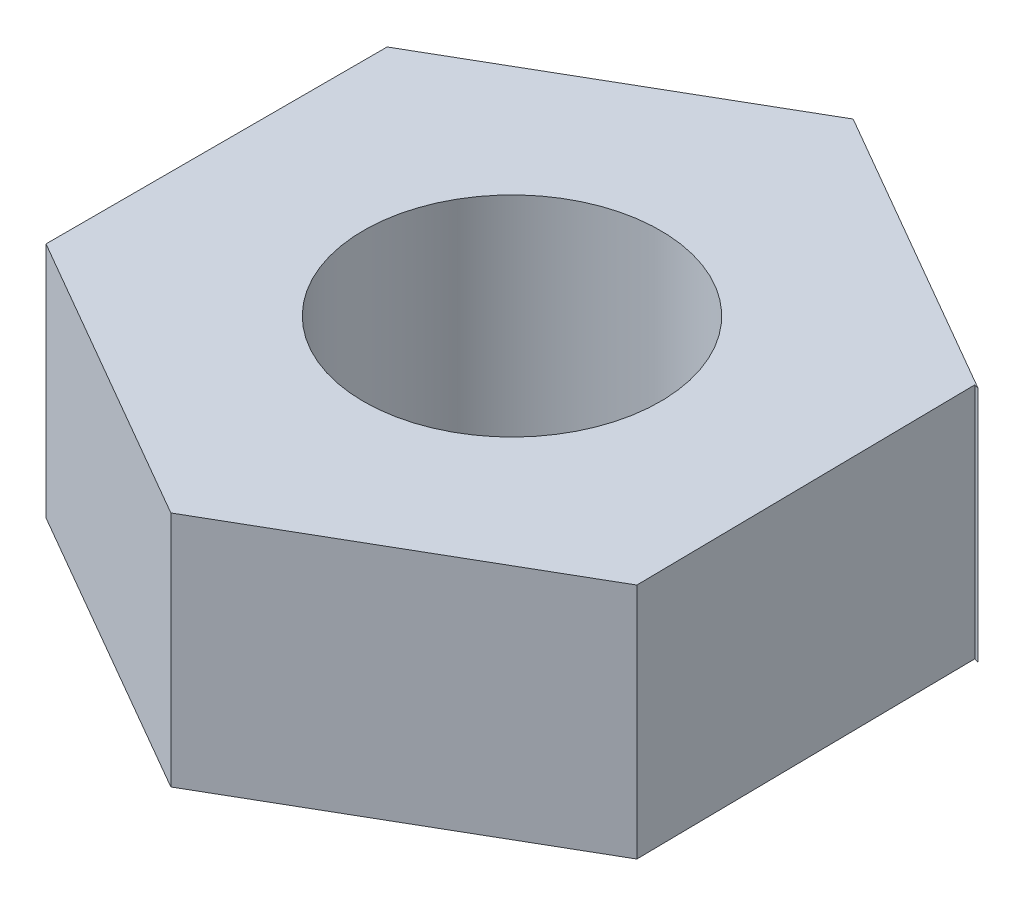
ISO-10303-21;
HEADER;
FILE_DESCRIPTION(('STEP AP214'),'2;1');
FILE_NAME('part.step','',(''),(''),'','','');
FILE_SCHEMA(('AUTOMOTIVE_DESIGN { 1 0 10303 214 1 1 1 1 }'));
ENDSEC;
DATA;
#1=APPLICATION_CONTEXT('core data for automotive mechanical design processes');
#2=APPLICATION_PROTOCOL_DEFINITION('international standard','automotive_design',2000,#1);
#3=PRODUCT_CONTEXT('',#1,'mechanical');
#4=PRODUCT('Part','Part','',(#3));
#5=PRODUCT_RELATED_PRODUCT_CATEGORY('part','',(#4));
#6=PRODUCT_DEFINITION_FORMATION('','',#4);
#7=PRODUCT_DEFINITION_CONTEXT('part definition',#1,'design');
#8=PRODUCT_DEFINITION('design','',#6,#7);
#9=PRODUCT_DEFINITION_SHAPE('','',#8);
#10=(LENGTH_UNIT() NAMED_UNIT(*) SI_UNIT(.MILLI.,.METRE.));
#11=(NAMED_UNIT(*) PLANE_ANGLE_UNIT() SI_UNIT($,.RADIAN.));
#12=(NAMED_UNIT(*) SI_UNIT($,.STERADIAN.) SOLID_ANGLE_UNIT());
#13=UNCERTAINTY_MEASURE_WITH_UNIT(LENGTH_MEASURE(1.E-05),#10,'distance_accuracy_value','');
#14=(GEOMETRIC_REPRESENTATION_CONTEXT(3) GLOBAL_UNCERTAINTY_ASSIGNED_CONTEXT((#13)) GLOBAL_UNIT_ASSIGNED_CONTEXT((#10,
#11,#12)) REPRESENTATION_CONTEXT('',''));
#15=CARTESIAN_POINT('',(0.,0.,0.));
#16=DIRECTION('',(0.,0.,1.));
#17=DIRECTION('',(1.,0.,0.));
#18=AXIS2_PLACEMENT_3D('',#15,#16,#17);
#19=CARTESIAN_POINT('',(-1.99185842870421,1.6,0.));
#20=DIRECTION('',(-1.,0.,0.));
#21=DIRECTION('',(0.,0.,1.));
#22=AXIS2_PLACEMENT_3D('',#19,#20,#21);
#23=PLANE('',#22);
#24=DIRECTION('',(0.,0.,-1.));
#25=VECTOR('',#24,1.);
#26=CARTESIAN_POINT('',(-1.99185842870421,0.,0.));
#27=LINE('',#26,#25);
#28=CARTESIAN_POINT('',(-1.99185842870422,0.,1.14999999999998));
#29=VERTEX_POINT('',#28);
#30=CARTESIAN_POINT('',(-1.9918584287042,0.,-1.15000000000002));
#31=VERTEX_POINT('',#30);
#32=EDGE_CURVE('E124',#29,#31,#27,.T.);
#33=ORIENTED_EDGE('',*,*,#32,.F.);
#34=DIRECTION('',(0.,-1.,0.));
#35=VECTOR('',#34,1.);
#36=CARTESIAN_POINT('',(-1.99185842870422,1.6,1.14999999999998));
#37=LINE('',#36,#35);
#38=CARTESIAN_POINT('',(-1.99185842870422,1.6,1.14999999999998));
#39=VERTEX_POINT('',#38);
#40=EDGE_CURVE('E11',#39,#29,#37,.T.);
#41=ORIENTED_EDGE('',*,*,#40,.F.);
#42=DIRECTION('',(0.,0.,-1.));
#43=VECTOR('',#42,1.);
#44=CARTESIAN_POINT('',(-1.99185842870421,1.6,0.));
#45=LINE('',#44,#43);
#46=CARTESIAN_POINT('',(-1.9918584287042,1.6,-1.15000000000002));
#47=VERTEX_POINT('',#46);
#48=EDGE_CURVE('E163',#39,#47,#45,.T.);
#49=ORIENTED_EDGE('',*,*,#48,.T.);
#50=DIRECTION('',(0.,-1.,0.));
#51=VECTOR('',#50,1.);
#52=CARTESIAN_POINT('',(-1.9918584287042,1.6,-1.15000000000002));
#53=LINE('',#52,#51);
#54=EDGE_CURVE('E50',#47,#31,#53,.T.);
#55=ORIENTED_EDGE('',*,*,#54,.T.);
#56=EDGE_LOOP('',(#33,#41,#49,#55));
#57=FACE_BOUND('',#56,.T.);
#58=ADVANCED_FACE('F33',(#57),#23,.T.);
#59=CARTESIAN_POINT('',(-0.995929214352118,1.6,1.72499999999999));
#60=DIRECTION('',(-0.500000000000007,0.,0.866025403784434));
#61=DIRECTION('',(0.866025403784435,0.,0.500000000000007));
#62=AXIS2_PLACEMENT_3D('',#59,#60,#61);
#63=PLANE('',#62);
#64=DIRECTION('',(-0.866025403784434,0.,-0.500000000000007));
#65=VECTOR('',#64,1.);
#66=CARTESIAN_POINT('',(-0.995929214352118,0.,1.72499999999999));
#67=LINE('',#66,#65);
#68=CARTESIAN_POINT('',(0.,0.,2.3));
#69=VERTEX_POINT('',#68);
#70=EDGE_CURVE('E126',#69,#29,#67,.T.);
#71=ORIENTED_EDGE('',*,*,#70,.F.);
#72=DIRECTION('',(0.,-1.,0.));
#73=VECTOR('',#72,1.);
#74=CARTESIAN_POINT('',(0.,1.6,2.3));
#75=LINE('',#74,#73);
#76=CARTESIAN_POINT('',(0.,1.6,2.3));
#77=VERTEX_POINT('',#76);
#78=EDGE_CURVE('E42',#77,#69,#75,.T.);
#79=ORIENTED_EDGE('',*,*,#78,.F.);
#80=DIRECTION('',(-0.866025403784434,0.,-0.500000000000007));
#81=VECTOR('',#80,1.);
#82=CARTESIAN_POINT('',(-0.995929214352118,1.6,1.72499999999999));
#83=LINE('',#82,#81);
#84=EDGE_CURVE('E161',#77,#39,#83,.T.);
#85=ORIENTED_EDGE('',*,*,#84,.T.);
#86=ORIENTED_EDGE('',*,*,#40,.T.);
#87=EDGE_LOOP('',(#71,#79,#85,#86));
#88=FACE_BOUND('',#87,.T.);
#89=ADVANCED_FACE('F155',(#88),#63,.T.);
#90=CARTESIAN_POINT('',(0.995929214352093,1.6,1.72500000000001));
#91=DIRECTION('',(0.499999999999994,0.,0.866025403784442));
#92=DIRECTION('',(0.866025403784442,0.,-0.499999999999994));
#93=AXIS2_PLACEMENT_3D('',#90,#91,#92);
#94=PLANE('',#93);
#95=DIRECTION('',(-0.866025403784442,0.,0.499999999999995));
#96=VECTOR('',#95,1.);
#97=CARTESIAN_POINT('',(0.995929214352093,0.,1.72500000000001));
#98=LINE('',#97,#96);
#99=CARTESIAN_POINT('',(1.99185842870421,0.,1.15000000000001));
#100=VERTEX_POINT('',#99);
#101=EDGE_CURVE('E129',#100,#69,#98,.T.);
#102=ORIENTED_EDGE('',*,*,#101,.F.);
#103=DIRECTION('',(0.,-1.,0.));
#104=VECTOR('',#103,1.);
#105=CARTESIAN_POINT('',(1.99185842870421,1.6,1.15000000000001));
#106=LINE('',#105,#104);
#107=CARTESIAN_POINT('',(1.99185842870421,1.6,1.15000000000001));
#108=VERTEX_POINT('',#107);
#109=EDGE_CURVE('E145',#108,#100,#106,.T.);
#110=ORIENTED_EDGE('',*,*,#109,.F.);
#111=DIRECTION('',(-0.866025403784442,0.,0.499999999999995));
#112=VECTOR('',#111,1.);
#113=CARTESIAN_POINT('',(0.995929214352093,1.6,1.72500000000001));
#114=LINE('',#113,#112);
#115=EDGE_CURVE('E151',#108,#77,#114,.T.);
#116=ORIENTED_EDGE('',*,*,#115,.T.);
#117=ORIENTED_EDGE('',*,*,#78,.T.);
#118=EDGE_LOOP('',(#102,#110,#116,#117));
#119=FACE_BOUND('',#118,.T.);
#120=ADVANCED_FACE('F150',(#119),#94,.T.);
#121=CARTESIAN_POINT('',(1.9767126415659,1.6,-0.0254697068984855));
#122=DIRECTION('',(0.999917000257078,0.,-0.0128838114270296));
#123=DIRECTION('',(-0.0128838114270296,0.,-0.999917000257078));
#124=AXIS2_PLACEMENT_3D('',#121,#122,#123);
#125=PLANE('',#124);
#126=DIRECTION('',(0.0128838114270296,0.,0.999917000257078));
#127=VECTOR('',#126,1.);
#128=CARTESIAN_POINT('',(1.9767126415659,0.,-0.0254697068984855));
#129=LINE('',#128,#127);
#130=CARTESIAN_POINT('',(1.9621216011351,0.,-1.15788533257131));
#131=VERTEX_POINT('',#130);
#132=EDGE_CURVE('E132',#131,#100,#129,.T.);
#133=ORIENTED_EDGE('',*,*,#132,.F.);
#134=DIRECTION('',(0.,-1.,0.));
#135=VECTOR('',#134,1.);
#136=CARTESIAN_POINT('',(1.9621216011351,1.6,-1.15788533257131));
#137=LINE('',#136,#135);
#138=CARTESIAN_POINT('',(1.9621216011351,1.6,-1.15788533257131));
#139=VERTEX_POINT('',#138);
#140=EDGE_CURVE('E103',#139,#131,#137,.T.);
#141=ORIENTED_EDGE('',*,*,#140,.F.);
#142=DIRECTION('',(0.0128838114270296,0.,0.999917000257078));
#143=VECTOR('',#142,1.);
#144=CARTESIAN_POINT('',(1.9767126415659,1.6,-0.0254697068984855));
#145=LINE('',#144,#143);
#146=EDGE_CURVE('E113',#139,#108,#145,.T.);
#147=ORIENTED_EDGE('',*,*,#146,.T.);
#148=ORIENTED_EDGE('',*,*,#109,.T.);
#149=EDGE_LOOP('',(#133,#141,#147,#148));
#150=FACE_BOUND('',#149,.T.);
#151=ADVANCED_FACE('F160',(#150),#125,.T.);
#152=CARTESIAN_POINT('',(0.415769592089128,1.6,-1.56793243108264));
#153=DIRECTION('',(-0.25631232080257,0.,0.966594017261022));
#154=DIRECTION('',(0.966594017261022,0.,0.25631232080257));
#155=AXIS2_PLACEMENT_3D('',#152,#153,#154);
#156=PLANE('',#155);
#157=DIRECTION('',(-0.966594017261022,0.,-0.25631232080257));
#158=VECTOR('',#157,1.);
#159=CARTESIAN_POINT('',(0.415769592089128,0.,-1.56793243108264));
#160=LINE('',#159,#158);
#161=CARTESIAN_POINT('',(1.99185842870421,0.,-1.15));
#162=VERTEX_POINT('',#161);
#163=EDGE_CURVE('E99',#162,#131,#160,.T.);
#164=ORIENTED_EDGE('',*,*,#163,.F.);
#165=DIRECTION('',(0.,-1.,0.));
#166=VECTOR('',#165,1.);
#167=CARTESIAN_POINT('',(1.99185842870421,1.6,-1.15));
#168=LINE('',#167,#166);
#169=CARTESIAN_POINT('',(1.99185842870421,1.6,-1.15));
#170=VERTEX_POINT('',#169);
#171=EDGE_CURVE('E94',#170,#162,#168,.T.);
#172=ORIENTED_EDGE('',*,*,#171,.F.);
#173=DIRECTION('',(-0.966594017261022,0.,-0.25631232080257));
#174=VECTOR('',#173,1.);
#175=CARTESIAN_POINT('',(0.415769592089128,1.6,-1.56793243108264));
#176=LINE('',#175,#174);
#177=EDGE_CURVE('E97',#170,#139,#176,.T.);
#178=ORIENTED_EDGE('',*,*,#177,.T.);
#179=ORIENTED_EDGE('',*,*,#140,.T.);
#180=EDGE_LOOP('',(#164,#172,#178,#179));
#181=FACE_BOUND('',#180,.T.);
#182=ADVANCED_FACE('F96',(#181),#156,.T.);
#183=CARTESIAN_POINT('',(0.995929214352106,1.6,-1.725));
#184=DIRECTION('',(0.500000000000001,0.,-0.866025403784438));
#185=DIRECTION('',(-0.866025403784438,0.,-0.500000000000001));
#186=AXIS2_PLACEMENT_3D('',#183,#184,#185);
#187=PLANE('',#186);
#188=DIRECTION('',(0.866025403784438,0.,0.500000000000001));
#189=VECTOR('',#188,1.);
#190=CARTESIAN_POINT('',(0.995929214352106,0.,-1.725));
#191=LINE('',#190,#189);
#192=CARTESIAN_POINT('',(0.,0.,-2.3));
#193=VERTEX_POINT('',#192);
#194=EDGE_CURVE('E136',#193,#162,#191,.T.);
#195=ORIENTED_EDGE('',*,*,#194,.F.);
#196=DIRECTION('',(0.,-1.,0.));
#197=VECTOR('',#196,1.);
#198=CARTESIAN_POINT('',(0.,1.6,-2.3));
#199=LINE('',#198,#197);
#200=CARTESIAN_POINT('',(0.,1.6,-2.3));
#201=VERTEX_POINT('',#200);
#202=EDGE_CURVE('E72',#201,#193,#199,.T.);
#203=ORIENTED_EDGE('',*,*,#202,.F.);
#204=DIRECTION('',(0.866025403784438,0.,0.500000000000001));
#205=VECTOR('',#204,1.);
#206=CARTESIAN_POINT('',(0.995929214352106,1.6,-1.725));
#207=LINE('',#206,#205);
#208=EDGE_CURVE('E110',#201,#170,#207,.T.);
#209=ORIENTED_EDGE('',*,*,#208,.T.);
#210=ORIENTED_EDGE('',*,*,#171,.T.);
#211=EDGE_LOOP('',(#195,#203,#209,#210));
#212=FACE_BOUND('',#211,.T.);
#213=ADVANCED_FACE('F115',(#212),#187,.T.);
#214=CARTESIAN_POINT('',(0.,1.6,0.));
#215=DIRECTION('',(0.,-1.,0.));
#216=DIRECTION('',(0.,0.,-1.));
#217=AXIS2_PLACEMENT_3D('',#214,#215,#216);
#218=CYLINDRICAL_SURFACE('',#217,0.999999999999999);
#219=CARTESIAN_POINT('',(0.,1.6,0.));
#220=DIRECTION('',(0.,1.,0.));
#221=DIRECTION('',(0.,0.,1.));
#222=AXIS2_PLACEMENT_3D('',#219,#220,#221);
#223=CIRCLE('',#222,0.999999999999999);
#224=CARTESIAN_POINT('',(0.,1.6,0.999999999999999));
#225=VERTEX_POINT('',#224);
#226=EDGE_CURVE('E141',#225,#225,#223,.T.);
#227=ORIENTED_EDGE('',*,*,#226,.T.);
#228=EDGE_LOOP('',(#227));
#229=FACE_BOUND('',#228,.T.);
#230=CARTESIAN_POINT('',(0.,0.,0.));
#231=DIRECTION('',(0.,1.,0.));
#232=DIRECTION('',(0.,0.,1.));
#233=AXIS2_PLACEMENT_3D('',#230,#231,#232);
#234=CIRCLE('',#233,0.999999999999999);
#235=CARTESIAN_POINT('',(0.,0.,0.999999999999999));
#236=VERTEX_POINT('',#235);
#237=EDGE_CURVE('E121',#236,#236,#234,.T.);
#238=ORIENTED_EDGE('',*,*,#237,.F.);
#239=EDGE_LOOP('',(#238));
#240=FACE_BOUND('',#239,.T.);
#241=ADVANCED_FACE('F35',(#229,#240),#218,.F.);
#242=CARTESIAN_POINT('',(-0.995929214352098,1.6,-1.72500000000001));
#243=DIRECTION('',(-0.499999999999995,0.,-0.866025403784442));
#244=DIRECTION('',(-0.866025403784442,0.,0.499999999999995));
#245=AXIS2_PLACEMENT_3D('',#242,#243,#244);
#246=PLANE('',#245);
#247=DIRECTION('',(0.866025403784442,0.,-0.499999999999995));
#248=VECTOR('',#247,1.);
#249=CARTESIAN_POINT('',(-0.995929214352098,0.,-1.72500000000001));
#250=LINE('',#249,#248);
#251=EDGE_CURVE('E138',#31,#193,#250,.T.);
#252=ORIENTED_EDGE('',*,*,#251,.F.);
#253=ORIENTED_EDGE('',*,*,#54,.F.);
#254=DIRECTION('',(0.866025403784442,0.,-0.499999999999995));
#255=VECTOR('',#254,1.);
#256=CARTESIAN_POINT('',(-0.995929214352098,1.6,-1.72500000000001));
#257=LINE('',#256,#255);
#258=EDGE_CURVE('E116',#47,#201,#257,.T.);
#259=ORIENTED_EDGE('',*,*,#258,.T.);
#260=ORIENTED_EDGE('',*,*,#202,.T.);
#261=EDGE_LOOP('',(#252,#253,#259,#260));
#262=FACE_BOUND('',#261,.T.);
#263=ADVANCED_FACE('F173',(#262),#246,.T.);
#264=CARTESIAN_POINT('',(0.,1.6,0.));
#265=DIRECTION('',(0.,1.,0.));
#266=DIRECTION('',(0.,0.,1.));
#267=AXIS2_PLACEMENT_3D('',#264,#265,#266);
#268=PLANE('',#267);
#269=ORIENTED_EDGE('',*,*,#226,.F.);
#270=EDGE_LOOP('',(#269));
#271=FACE_BOUND('',#270,.T.);
#272=ORIENTED_EDGE('',*,*,#48,.F.);
#273=ORIENTED_EDGE('',*,*,#84,.F.);
#274=ORIENTED_EDGE('',*,*,#115,.F.);
#275=ORIENTED_EDGE('',*,*,#146,.F.);
#276=ORIENTED_EDGE('',*,*,#177,.F.);
#277=ORIENTED_EDGE('',*,*,#208,.F.);
#278=ORIENTED_EDGE('',*,*,#258,.F.);
#279=EDGE_LOOP('',(#272,#273,#274,#275,#276,#277,#278));
#280=FACE_BOUND('',#279,.T.);
#281=ADVANCED_FACE('F108',(#271,#280),#268,.T.);
#282=CARTESIAN_POINT('',(0.,0.,0.));
#283=DIRECTION('',(0.,1.,0.));
#284=DIRECTION('',(0.,0.,1.));
#285=AXIS2_PLACEMENT_3D('',#282,#283,#284);
#286=PLANE('',#285);
#287=ORIENTED_EDGE('',*,*,#237,.T.);
#288=EDGE_LOOP('',(#287));
#289=FACE_BOUND('',#288,.T.);
#290=ORIENTED_EDGE('',*,*,#32,.T.);
#291=ORIENTED_EDGE('',*,*,#251,.T.);
#292=ORIENTED_EDGE('',*,*,#194,.T.);
#293=ORIENTED_EDGE('',*,*,#163,.T.);
#294=ORIENTED_EDGE('',*,*,#132,.T.);
#295=ORIENTED_EDGE('',*,*,#101,.T.);
#296=ORIENTED_EDGE('',*,*,#70,.T.);
#297=EDGE_LOOP('',(#290,#291,#292,#293,#294,#295,#296));
#298=FACE_BOUND('',#297,.T.);
#299=ADVANCED_FACE('F157',(#289,#298),#286,.F.);
#300=CLOSED_SHELL('',(#58,#89,#120,#151,#182,#213,#241,#263,#281,#299));
#301=MANIFOLD_SOLID_BREP('B2',#300);
#302=ADVANCED_BREP_SHAPE_REPRESENTATION('',(#18,#301),#14);
#303=SHAPE_DEFINITION_REPRESENTATION(#9,#302);
ENDSEC;
END-ISO-10303-21;
